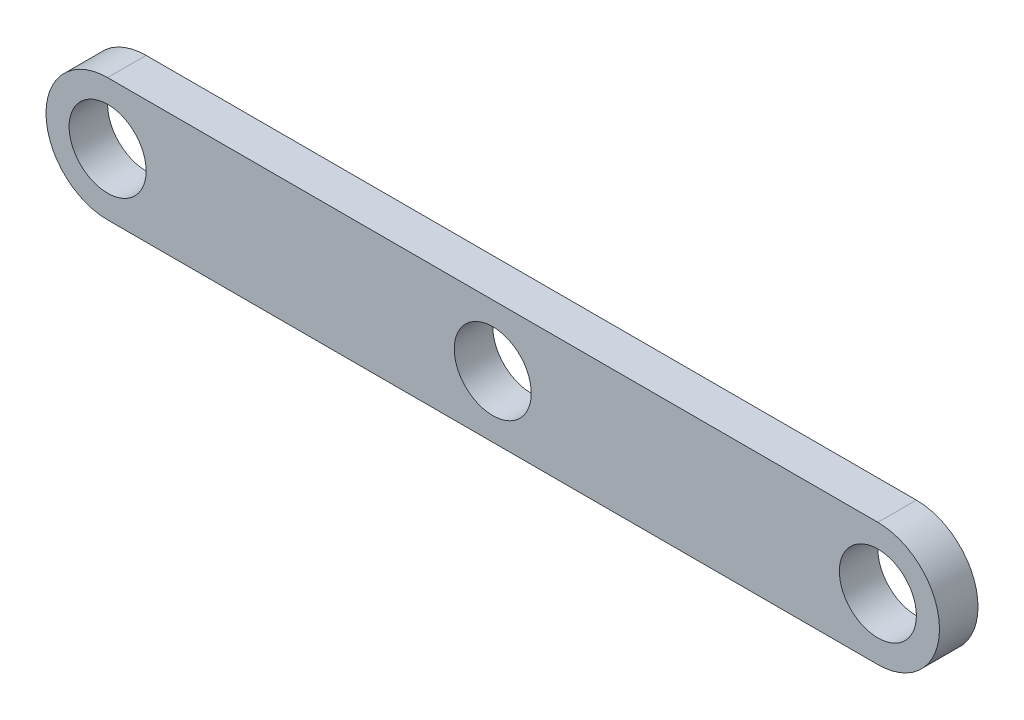
ISO-10303-21;
HEADER;
FILE_DESCRIPTION(('STEP AP214'),'2;1');
FILE_NAME('part.step','',(''),(''),'','','');
FILE_SCHEMA(('AUTOMOTIVE_DESIGN { 1 0 10303 214 1 1 1 1 }'));
ENDSEC;
DATA;
#1=APPLICATION_CONTEXT('core data for automotive mechanical design processes');
#2=APPLICATION_PROTOCOL_DEFINITION('international standard','automotive_design',2000,#1);
#3=PRODUCT_CONTEXT('',#1,'mechanical');
#4=PRODUCT('Part','Part','',(#3));
#5=PRODUCT_RELATED_PRODUCT_CATEGORY('part','',(#4));
#6=PRODUCT_DEFINITION_FORMATION('','',#4);
#7=PRODUCT_DEFINITION_CONTEXT('part definition',#1,'design');
#8=PRODUCT_DEFINITION('design','',#6,#7);
#9=PRODUCT_DEFINITION_SHAPE('','',#8);
#10=(LENGTH_UNIT() NAMED_UNIT(*) SI_UNIT(.MILLI.,.METRE.));
#11=(NAMED_UNIT(*) PLANE_ANGLE_UNIT() SI_UNIT($,.RADIAN.));
#12=(NAMED_UNIT(*) SI_UNIT($,.STERADIAN.) SOLID_ANGLE_UNIT());
#13=UNCERTAINTY_MEASURE_WITH_UNIT(LENGTH_MEASURE(1.E-05),#10,'distance_accuracy_value','');
#14=(GEOMETRIC_REPRESENTATION_CONTEXT(3) GLOBAL_UNCERTAINTY_ASSIGNED_CONTEXT((#13)) GLOBAL_UNIT_ASSIGNED_CONTEXT((#10,
#11,#12)) REPRESENTATION_CONTEXT('',''));
#15=CARTESIAN_POINT('',(0.,0.,0.));
#16=DIRECTION('',(0.,0.,1.));
#17=DIRECTION('',(1.,0.,0.));
#18=AXIS2_PLACEMENT_3D('',#15,#16,#17);
#19=CARTESIAN_POINT('',(-50.,0.,2.5));
#20=DIRECTION('',(0.,0.,1.));
#21=DIRECTION('',(1.,0.,0.));
#22=AXIS2_PLACEMENT_3D('',#19,#20,#21);
#23=PLANE('',#22);
#24=CARTESIAN_POINT('',(50.,0.,2.5));
#25=DIRECTION('',(0.,0.,1.));
#26=DIRECTION('',(1.,0.,0.));
#27=AXIS2_PLACEMENT_3D('',#24,#25,#26);
#28=CIRCLE('',#27,5.);
#29=CARTESIAN_POINT('',(55.,0.,2.5));
#30=VERTEX_POINT('',#29);
#31=EDGE_CURVE('E117',#30,#30,#28,.T.);
#32=ORIENTED_EDGE('',*,*,#31,.F.);
#33=EDGE_LOOP('',(#32));
#34=FACE_BOUND('',#33,.T.);
#35=CARTESIAN_POINT('',(-50.,0.,2.5));
#36=DIRECTION('',(0.,0.,1.));
#37=DIRECTION('',(1.,0.,0.));
#38=AXIS2_PLACEMENT_3D('',#35,#36,#37);
#39=CIRCLE('',#38,8.);
#40=CARTESIAN_POINT('',(-50.,8.00000000000001,2.5));
#41=VERTEX_POINT('',#40);
#42=CARTESIAN_POINT('',(-50.,-7.99999999999999,2.5));
#43=VERTEX_POINT('',#42);
#44=EDGE_CURVE('E87',#41,#43,#39,.T.);
#45=ORIENTED_EDGE('',*,*,#44,.T.);
#46=DIRECTION('',(1.,0.,0.));
#47=VECTOR('',#46,1.);
#48=CARTESIAN_POINT('',(-50.,-7.99999999999999,2.5));
#49=LINE('',#48,#47);
#50=CARTESIAN_POINT('',(50.,-8.,2.5));
#51=VERTEX_POINT('',#50);
#52=EDGE_CURVE('E82',#43,#51,#49,.T.);
#53=ORIENTED_EDGE('',*,*,#52,.T.);
#54=CARTESIAN_POINT('',(50.,0.,2.5));
#55=DIRECTION('',(0.,0.,1.));
#56=DIRECTION('',(1.,0.,0.));
#57=AXIS2_PLACEMENT_3D('',#54,#55,#56);
#58=CIRCLE('',#57,8.);
#59=CARTESIAN_POINT('',(50.,8.00000000000001,2.5));
#60=VERTEX_POINT('',#59);
#61=EDGE_CURVE('E85',#51,#60,#58,.T.);
#62=ORIENTED_EDGE('',*,*,#61,.T.);
#63=DIRECTION('',(-1.,0.,0.));
#64=VECTOR('',#63,1.);
#65=CARTESIAN_POINT('',(-50.,8.00000000000001,2.5));
#66=LINE('',#65,#64);
#67=EDGE_CURVE('E52',#60,#41,#66,.T.);
#68=ORIENTED_EDGE('',*,*,#67,.T.);
#69=EDGE_LOOP('',(#45,#53,#62,#68));
#70=FACE_BOUND('',#69,.T.);
#71=CARTESIAN_POINT('',(-50.,0.,2.5));
#72=DIRECTION('',(0.,0.,1.));
#73=DIRECTION('',(1.,0.,0.));
#74=AXIS2_PLACEMENT_3D('',#71,#72,#73);
#75=CIRCLE('',#74,5.);
#76=CARTESIAN_POINT('',(-45.,0.,2.5));
#77=VERTEX_POINT('',#76);
#78=EDGE_CURVE('E102',#77,#77,#75,.T.);
#79=ORIENTED_EDGE('',*,*,#78,.F.);
#80=EDGE_LOOP('',(#79));
#81=FACE_BOUND('',#80,.T.);
#82=CARTESIAN_POINT('',(0.,0.,2.5));
#83=DIRECTION('',(0.,0.,1.));
#84=DIRECTION('',(1.,0.,0.));
#85=AXIS2_PLACEMENT_3D('',#82,#83,#84);
#86=CIRCLE('',#85,5.);
#87=CARTESIAN_POINT('',(5.,0.,2.5));
#88=VERTEX_POINT('',#87);
#89=EDGE_CURVE('E123',#88,#88,#86,.T.);
#90=ORIENTED_EDGE('',*,*,#89,.F.);
#91=EDGE_LOOP('',(#90));
#92=FACE_BOUND('',#91,.T.);
#93=ADVANCED_FACE('F35',(#34,#70,#81,#92),#23,.T.);
#94=CARTESIAN_POINT('',(-50.,0.,-2.5));
#95=DIRECTION('',(0.,0.,1.));
#96=DIRECTION('',(1.,0.,0.));
#97=AXIS2_PLACEMENT_3D('',#94,#95,#96);
#98=PLANE('',#97);
#99=CARTESIAN_POINT('',(50.,0.,-2.5));
#100=DIRECTION('',(0.,0.,1.));
#101=DIRECTION('',(1.,0.,0.));
#102=AXIS2_PLACEMENT_3D('',#99,#100,#101);
#103=CIRCLE('',#102,5.);
#104=CARTESIAN_POINT('',(55.,0.,-2.5));
#105=VERTEX_POINT('',#104);
#106=EDGE_CURVE('E120',#105,#105,#103,.T.);
#107=ORIENTED_EDGE('',*,*,#106,.T.);
#108=EDGE_LOOP('',(#107));
#109=FACE_BOUND('',#108,.T.);
#110=CARTESIAN_POINT('',(-50.,0.,-2.5));
#111=DIRECTION('',(0.,0.,1.));
#112=DIRECTION('',(1.,0.,0.));
#113=AXIS2_PLACEMENT_3D('',#110,#111,#112);
#114=CIRCLE('',#113,8.);
#115=CARTESIAN_POINT('',(-50.,8.00000000000001,-2.5));
#116=VERTEX_POINT('',#115);
#117=CARTESIAN_POINT('',(-50.,-7.99999999999999,-2.5));
#118=VERTEX_POINT('',#117);
#119=EDGE_CURVE('E99',#116,#118,#114,.T.);
#120=ORIENTED_EDGE('',*,*,#119,.F.);
#121=DIRECTION('',(-1.,0.,0.));
#122=VECTOR('',#121,1.);
#123=CARTESIAN_POINT('',(-50.,8.00000000000001,-2.5));
#124=LINE('',#123,#122);
#125=CARTESIAN_POINT('',(50.,8.00000000000001,-2.5));
#126=VERTEX_POINT('',#125);
#127=EDGE_CURVE('E75',#126,#116,#124,.T.);
#128=ORIENTED_EDGE('',*,*,#127,.F.);
#129=CARTESIAN_POINT('',(50.,0.,-2.5));
#130=DIRECTION('',(0.,0.,1.));
#131=DIRECTION('',(1.,0.,0.));
#132=AXIS2_PLACEMENT_3D('',#129,#130,#131);
#133=CIRCLE('',#132,8.);
#134=CARTESIAN_POINT('',(50.,-8.,-2.5));
#135=VERTEX_POINT('',#134);
#136=EDGE_CURVE('E69',#135,#126,#133,.T.);
#137=ORIENTED_EDGE('',*,*,#136,.F.);
#138=DIRECTION('',(1.,0.,0.));
#139=VECTOR('',#138,1.);
#140=CARTESIAN_POINT('',(-50.,-7.99999999999999,-2.5));
#141=LINE('',#140,#139);
#142=EDGE_CURVE('E91',#118,#135,#141,.T.);
#143=ORIENTED_EDGE('',*,*,#142,.F.);
#144=EDGE_LOOP('',(#120,#128,#137,#143));
#145=FACE_BOUND('',#144,.T.);
#146=CARTESIAN_POINT('',(-50.,0.,-2.5));
#147=DIRECTION('',(0.,0.,1.));
#148=DIRECTION('',(1.,0.,0.));
#149=AXIS2_PLACEMENT_3D('',#146,#147,#148);
#150=CIRCLE('',#149,5.);
#151=CARTESIAN_POINT('',(-45.,0.,-2.5));
#152=VERTEX_POINT('',#151);
#153=EDGE_CURVE('E114',#152,#152,#150,.T.);
#154=ORIENTED_EDGE('',*,*,#153,.T.);
#155=EDGE_LOOP('',(#154));
#156=FACE_BOUND('',#155,.T.);
#157=CARTESIAN_POINT('',(0.,0.,-2.5));
#158=DIRECTION('',(0.,0.,1.));
#159=DIRECTION('',(1.,0.,0.));
#160=AXIS2_PLACEMENT_3D('',#157,#158,#159);
#161=CIRCLE('',#160,5.);
#162=CARTESIAN_POINT('',(5.,0.,-2.5));
#163=VERTEX_POINT('',#162);
#164=EDGE_CURVE('E126',#163,#163,#161,.T.);
#165=ORIENTED_EDGE('',*,*,#164,.T.);
#166=EDGE_LOOP('',(#165));
#167=FACE_BOUND('',#166,.T.);
#168=ADVANCED_FACE('F110',(#109,#145,#156,#167),#98,.F.);
#169=CARTESIAN_POINT('',(-50.,0.,2.5));
#170=DIRECTION('',(0.,0.,-1.));
#171=DIRECTION('',(-1.,0.,0.));
#172=AXIS2_PLACEMENT_3D('',#169,#170,#171);
#173=CYLINDRICAL_SURFACE('',#172,8.);
#174=ORIENTED_EDGE('',*,*,#119,.T.);
#175=DIRECTION('',(0.,0.,-1.));
#176=VECTOR('',#175,1.);
#177=CARTESIAN_POINT('',(-50.,-7.99999999999999,2.5));
#178=LINE('',#177,#176);
#179=EDGE_CURVE('E11',#43,#118,#178,.T.);
#180=ORIENTED_EDGE('',*,*,#179,.F.);
#181=ORIENTED_EDGE('',*,*,#44,.F.);
#182=DIRECTION('',(0.,0.,-1.));
#183=VECTOR('',#182,1.);
#184=CARTESIAN_POINT('',(-50.,8.00000000000001,2.5));
#185=LINE('',#184,#183);
#186=EDGE_CURVE('E95',#41,#116,#185,.T.);
#187=ORIENTED_EDGE('',*,*,#186,.T.);
#188=EDGE_LOOP('',(#174,#180,#181,#187));
#189=FACE_BOUND('',#188,.T.);
#190=ADVANCED_FACE('F37',(#189),#173,.T.);
#191=CARTESIAN_POINT('',(-50.,-7.99999999999999,2.5));
#192=DIRECTION('',(0.,1.,0.));
#193=DIRECTION('',(0.,0.,1.));
#194=AXIS2_PLACEMENT_3D('',#191,#192,#193);
#195=PLANE('',#194);
#196=ORIENTED_EDGE('',*,*,#142,.T.);
#197=DIRECTION('',(0.,0.,-1.));
#198=VECTOR('',#197,1.);
#199=CARTESIAN_POINT('',(50.,-8.,2.5));
#200=LINE('',#199,#198);
#201=EDGE_CURVE('E44',#51,#135,#200,.T.);
#202=ORIENTED_EDGE('',*,*,#201,.F.);
#203=ORIENTED_EDGE('',*,*,#52,.F.);
#204=ORIENTED_EDGE('',*,*,#179,.T.);
#205=EDGE_LOOP('',(#196,#202,#203,#204));
#206=FACE_BOUND('',#205,.T.);
#207=ADVANCED_FACE('F90',(#206),#195,.F.);
#208=CARTESIAN_POINT('',(50.,0.,2.5));
#209=DIRECTION('',(0.,0.,-1.));
#210=DIRECTION('',(-1.,0.,0.));
#211=AXIS2_PLACEMENT_3D('',#208,#209,#210);
#212=CYLINDRICAL_SURFACE('',#211,8.);
#213=ORIENTED_EDGE('',*,*,#136,.T.);
#214=DIRECTION('',(0.,0.,-1.));
#215=VECTOR('',#214,1.);
#216=CARTESIAN_POINT('',(50.,8.00000000000001,2.5));
#217=LINE('',#216,#215);
#218=EDGE_CURVE('E92',#60,#126,#217,.T.);
#219=ORIENTED_EDGE('',*,*,#218,.F.);
#220=ORIENTED_EDGE('',*,*,#61,.F.);
#221=ORIENTED_EDGE('',*,*,#201,.T.);
#222=EDGE_LOOP('',(#213,#219,#220,#221));
#223=FACE_BOUND('',#222,.T.);
#224=ADVANCED_FACE('F93',(#223),#212,.T.);
#225=CARTESIAN_POINT('',(-50.,8.00000000000001,2.5));
#226=DIRECTION('',(0.,-1.,0.));
#227=DIRECTION('',(1.,0.,0.));
#228=AXIS2_PLACEMENT_3D('',#225,#226,#227);
#229=PLANE('',#228);
#230=ORIENTED_EDGE('',*,*,#127,.T.);
#231=ORIENTED_EDGE('',*,*,#186,.F.);
#232=ORIENTED_EDGE('',*,*,#67,.F.);
#233=ORIENTED_EDGE('',*,*,#218,.T.);
#234=EDGE_LOOP('',(#230,#231,#232,#233));
#235=FACE_BOUND('',#234,.T.);
#236=ADVANCED_FACE('F107',(#235),#229,.F.);
#237=CARTESIAN_POINT('',(-50.,0.,2.5));
#238=DIRECTION('',(0.,0.,-1.));
#239=DIRECTION('',(-1.,0.,0.));
#240=AXIS2_PLACEMENT_3D('',#237,#238,#239);
#241=CYLINDRICAL_SURFACE('',#240,5.);
#242=ORIENTED_EDGE('',*,*,#78,.T.);
#243=EDGE_LOOP('',(#242));
#244=FACE_BOUND('',#243,.T.);
#245=ORIENTED_EDGE('',*,*,#153,.F.);
#246=EDGE_LOOP('',(#245));
#247=FACE_BOUND('',#246,.T.);
#248=ADVANCED_FACE('F145',(#244,#247),#241,.F.);
#249=CARTESIAN_POINT('',(50.,0.,2.5));
#250=DIRECTION('',(0.,0.,-1.));
#251=DIRECTION('',(-1.,0.,0.));
#252=AXIS2_PLACEMENT_3D('',#249,#250,#251);
#253=CYLINDRICAL_SURFACE('',#252,5.);
#254=ORIENTED_EDGE('',*,*,#31,.T.);
#255=EDGE_LOOP('',(#254));
#256=FACE_BOUND('',#255,.T.);
#257=ORIENTED_EDGE('',*,*,#106,.F.);
#258=EDGE_LOOP('',(#257));
#259=FACE_BOUND('',#258,.T.);
#260=ADVANCED_FACE('F191',(#256,#259),#253,.F.);
#261=CARTESIAN_POINT('',(0.,0.,2.5));
#262=DIRECTION('',(0.,0.,-1.));
#263=DIRECTION('',(-1.,0.,0.));
#264=AXIS2_PLACEMENT_3D('',#261,#262,#263);
#265=CYLINDRICAL_SURFACE('',#264,5.);
#266=ORIENTED_EDGE('',*,*,#89,.T.);
#267=EDGE_LOOP('',(#266));
#268=FACE_BOUND('',#267,.T.);
#269=ORIENTED_EDGE('',*,*,#164,.F.);
#270=EDGE_LOOP('',(#269));
#271=FACE_BOUND('',#270,.T.);
#272=ADVANCED_FACE('F132',(#268,#271),#265,.F.);
#273=CLOSED_SHELL('',(#93,#168,#190,#207,#224,#236,#248,#260,#272));
#274=MANIFOLD_SOLID_BREP('B2',#273);
#275=ADVANCED_BREP_SHAPE_REPRESENTATION('',(#18,#274),#14);
#276=SHAPE_DEFINITION_REPRESENTATION(#9,#275);
ENDSEC;
END-ISO-10303-21;
